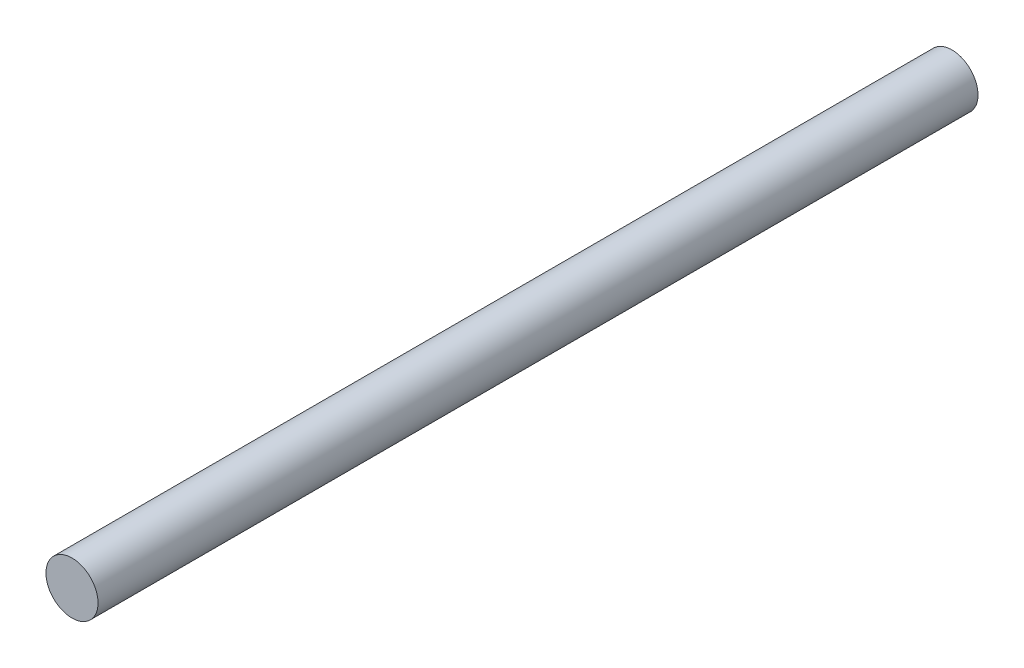
ISO-10303-21;
HEADER;
FILE_DESCRIPTION(('STEP AP214'),'2;1');
FILE_NAME('part.step','',(''),(''),'','','');
FILE_SCHEMA(('AUTOMOTIVE_DESIGN { 1 0 10303 214 1 1 1 1 }'));
ENDSEC;
DATA;
#1=APPLICATION_CONTEXT('core data for automotive mechanical design processes');
#2=APPLICATION_PROTOCOL_DEFINITION('international standard','automotive_design',2000,#1);
#3=PRODUCT_CONTEXT('',#1,'mechanical');
#4=PRODUCT('Part','Part','',(#3));
#5=PRODUCT_RELATED_PRODUCT_CATEGORY('part','',(#4));
#6=PRODUCT_DEFINITION_FORMATION('','',#4);
#7=PRODUCT_DEFINITION_CONTEXT('part definition',#1,'design');
#8=PRODUCT_DEFINITION('design','',#6,#7);
#9=PRODUCT_DEFINITION_SHAPE('','',#8);
#10=(LENGTH_UNIT() NAMED_UNIT(*) SI_UNIT(.MILLI.,.METRE.));
#11=(NAMED_UNIT(*) PLANE_ANGLE_UNIT() SI_UNIT($,.RADIAN.));
#12=(NAMED_UNIT(*) SI_UNIT($,.STERADIAN.) SOLID_ANGLE_UNIT());
#13=UNCERTAINTY_MEASURE_WITH_UNIT(LENGTH_MEASURE(1.E-05),#10,'distance_accuracy_value','');
#14=(GEOMETRIC_REPRESENTATION_CONTEXT(3) GLOBAL_UNCERTAINTY_ASSIGNED_CONTEXT((#13)) GLOBAL_UNIT_ASSIGNED_CONTEXT((#10,
#11,#12)) REPRESENTATION_CONTEXT('',''));
#15=CARTESIAN_POINT('',(0.,0.,0.));
#16=DIRECTION('',(0.,0.,1.));
#17=DIRECTION('',(1.,0.,0.));
#18=AXIS2_PLACEMENT_3D('',#15,#16,#17);
#19=CARTESIAN_POINT('',(0.,0.,169.));
#20=DIRECTION('',(0.,0.,-1.));
#21=DIRECTION('',(-1.,0.,0.));
#22=AXIS2_PLACEMENT_3D('',#19,#20,#21);
#23=CYLINDRICAL_SURFACE('',#22,5.);
#24=CARTESIAN_POINT('',(0.,0.,169.));
#25=DIRECTION('',(0.,0.,1.));
#26=DIRECTION('',(1.,0.,0.));
#27=AXIS2_PLACEMENT_3D('',#24,#25,#26);
#28=CIRCLE('',#27,5.);
#29=CARTESIAN_POINT('',(5.,0.,169.));
#30=VERTEX_POINT('',#29);
#31=EDGE_CURVE('E10',#30,#30,#28,.T.);
#32=ORIENTED_EDGE('',*,*,#31,.F.);
#33=EDGE_LOOP('',(#32));
#34=FACE_BOUND('',#33,.T.);
#35=CARTESIAN_POINT('',(0.,0.,0.));
#36=DIRECTION('',(0.,0.,1.));
#37=DIRECTION('',(1.,0.,0.));
#38=AXIS2_PLACEMENT_3D('',#35,#36,#37);
#39=CIRCLE('',#38,5.);
#40=CARTESIAN_POINT('',(5.,0.,0.));
#41=VERTEX_POINT('',#40);
#42=EDGE_CURVE('E36',#41,#41,#39,.T.);
#43=ORIENTED_EDGE('',*,*,#42,.T.);
#44=EDGE_LOOP('',(#43));
#45=FACE_BOUND('',#44,.T.);
#46=ADVANCED_FACE('F33',(#34,#45),#23,.T.);
#47=CARTESIAN_POINT('',(0.,0.,169.));
#48=DIRECTION('',(0.,0.,1.));
#49=DIRECTION('',(1.,0.,0.));
#50=AXIS2_PLACEMENT_3D('',#47,#48,#49);
#51=PLANE('',#50);
#52=ORIENTED_EDGE('',*,*,#31,.T.);
#53=EDGE_LOOP('',(#52));
#54=FACE_BOUND('',#53,.T.);
#55=ADVANCED_FACE('F48',(#54),#51,.T.);
#56=CARTESIAN_POINT('',(0.,0.,0.));
#57=DIRECTION('',(0.,0.,1.));
#58=DIRECTION('',(1.,0.,0.));
#59=AXIS2_PLACEMENT_3D('',#56,#57,#58);
#60=PLANE('',#59);
#61=ORIENTED_EDGE('',*,*,#42,.F.);
#62=EDGE_LOOP('',(#61));
#63=FACE_BOUND('',#62,.T.);
#64=ADVANCED_FACE('F46',(#63),#60,.F.);
#65=CLOSED_SHELL('',(#46,#55,#64));
#66=MANIFOLD_SOLID_BREP('B2',#65);
#67=ADVANCED_BREP_SHAPE_REPRESENTATION('',(#18,#66),#14);
#68=SHAPE_DEFINITION_REPRESENTATION(#9,#67);
ENDSEC;
END-ISO-10303-21;
